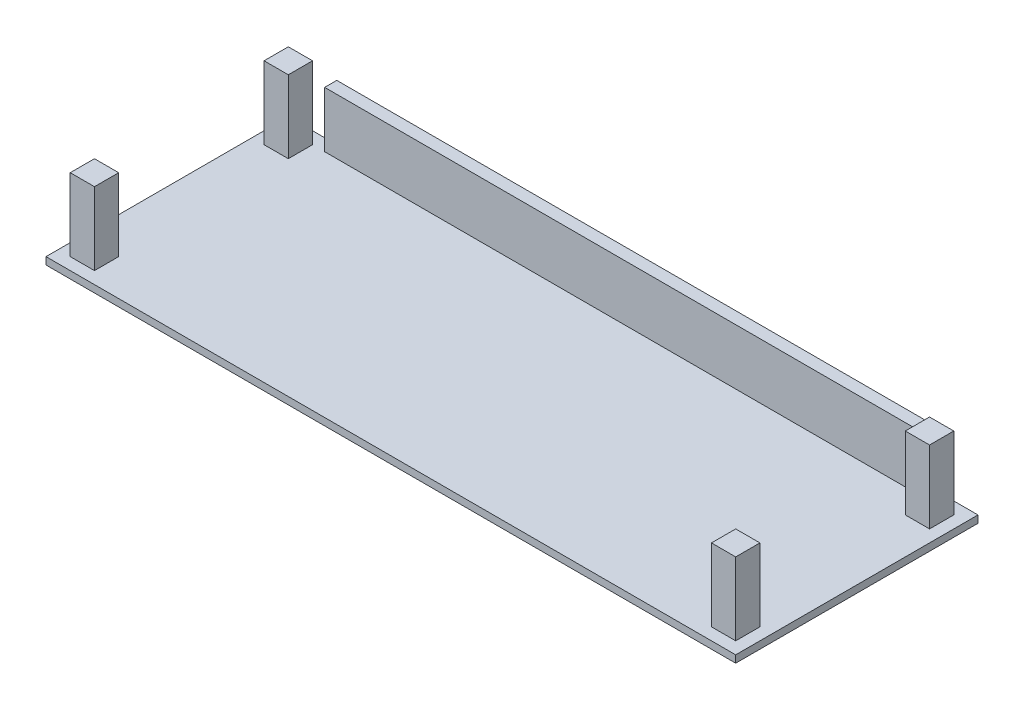
ISO-10303-21;
HEADER;
FILE_DESCRIPTION(('STEP AP214'),'2;1');
FILE_NAME('part.step','',(''),(''),'','','');
FILE_SCHEMA(('AUTOMOTIVE_DESIGN { 1 0 10303 214 1 1 1 1 }'));
ENDSEC;
DATA;
#1=APPLICATION_CONTEXT('core data for automotive mechanical design processes');
#2=APPLICATION_PROTOCOL_DEFINITION('international standard','automotive_design',2000,#1);
#3=PRODUCT_CONTEXT('',#1,'mechanical');
#4=PRODUCT('Part','Part','',(#3));
#5=PRODUCT_RELATED_PRODUCT_CATEGORY('part','',(#4));
#6=PRODUCT_DEFINITION_FORMATION('','',#4);
#7=PRODUCT_DEFINITION_CONTEXT('part definition',#1,'design');
#8=PRODUCT_DEFINITION('design','',#6,#7);
#9=PRODUCT_DEFINITION_SHAPE('','',#8);
#10=(LENGTH_UNIT() NAMED_UNIT(*) SI_UNIT(.MILLI.,.METRE.));
#11=(NAMED_UNIT(*) PLANE_ANGLE_UNIT() SI_UNIT($,.RADIAN.));
#12=(NAMED_UNIT(*) SI_UNIT($,.STERADIAN.) SOLID_ANGLE_UNIT());
#13=UNCERTAINTY_MEASURE_WITH_UNIT(LENGTH_MEASURE(1.E-05),#10,'distance_accuracy_value','');
#14=(GEOMETRIC_REPRESENTATION_CONTEXT(3) GLOBAL_UNCERTAINTY_ASSIGNED_CONTEXT((#13)) GLOBAL_UNIT_ASSIGNED_CONTEXT((#10,
#11,#12)) REPRESENTATION_CONTEXT('',''));
#15=CARTESIAN_POINT('',(0.,0.,0.));
#16=DIRECTION('',(0.,0.,1.));
#17=DIRECTION('',(1.,0.,0.));
#18=AXIS2_PLACEMENT_3D('',#15,#16,#17);
#19=CARTESIAN_POINT('',(0.,0.,0.));
#20=DIRECTION('',(0.,-1.,0.));
#21=DIRECTION('',(0.,0.,-1.));
#22=AXIS2_PLACEMENT_3D('',#19,#20,#21);
#23=PLANE('',#22);
#24=DIRECTION('',(0.,0.,1.));
#25=VECTOR('',#24,1.);
#26=CARTESIAN_POINT('',(127.320508075689,0.,-45.));
#27=LINE('',#26,#25);
#28=CARTESIAN_POINT('',(127.320508075689,0.,-45.));
#29=VERTEX_POINT('',#28);
#30=CARTESIAN_POINT('',(127.320508075689,0.,-35.));
#31=VERTEX_POINT('',#30);
#32=EDGE_CURVE('E221',#29,#31,#27,.T.);
#33=ORIENTED_EDGE('',*,*,#32,.F.);
#34=DIRECTION('',(-1.,0.,0.));
#35=VECTOR('',#34,1.);
#36=CARTESIAN_POINT('',(127.320508075689,0.,-45.));
#37=LINE('',#36,#35);
#38=CARTESIAN_POINT('',(137.320508075689,0.,-45.));
#39=VERTEX_POINT('',#38);
#40=EDGE_CURVE('E234',#39,#29,#37,.T.);
#41=ORIENTED_EDGE('',*,*,#40,.F.);
#42=DIRECTION('',(0.,0.,-1.));
#43=VECTOR('',#42,1.);
#44=CARTESIAN_POINT('',(137.320508075689,0.,-45.));
#45=LINE('',#44,#43);
#46=CARTESIAN_POINT('',(137.320508075689,0.,-35.));
#47=VERTEX_POINT('',#46);
#48=EDGE_CURVE('E243',#47,#39,#45,.T.);
#49=ORIENTED_EDGE('',*,*,#48,.F.);
#50=DIRECTION('',(1.,0.,0.));
#51=VECTOR('',#50,1.);
#52=CARTESIAN_POINT('',(127.320508075689,0.,-35.));
#53=LINE('',#52,#51);
#54=EDGE_CURVE('E224',#31,#47,#53,.T.);
#55=ORIENTED_EDGE('',*,*,#54,.F.);
#56=EDGE_LOOP('',(#33,#41,#49,#55));
#57=FACE_BOUND('',#56,.T.);
#58=DIRECTION('',(0.,0.,1.));
#59=VECTOR('',#58,1.);
#60=CARTESIAN_POINT('',(-137.320508075689,0.,35.));
#61=LINE('',#60,#59);
#62=CARTESIAN_POINT('',(-137.320508075689,0.,35.));
#63=VERTEX_POINT('',#62);
#64=CARTESIAN_POINT('',(-137.320508075689,0.,45.));
#65=VERTEX_POINT('',#64);
#66=EDGE_CURVE('E292',#63,#65,#61,.T.);
#67=ORIENTED_EDGE('',*,*,#66,.F.);
#68=DIRECTION('',(-1.,0.,0.));
#69=VECTOR('',#68,1.);
#70=CARTESIAN_POINT('',(-137.320508075689,0.,35.));
#71=LINE('',#70,#69);
#72=CARTESIAN_POINT('',(-127.320508075689,0.,35.));
#73=VERTEX_POINT('',#72);
#74=EDGE_CURVE('E297',#73,#63,#71,.T.);
#75=ORIENTED_EDGE('',*,*,#74,.F.);
#76=DIRECTION('',(0.,0.,-1.));
#77=VECTOR('',#76,1.);
#78=CARTESIAN_POINT('',(-127.320508075689,0.,35.));
#79=LINE('',#78,#77);
#80=CARTESIAN_POINT('',(-127.320508075689,0.,45.));
#81=VERTEX_POINT('',#80);
#82=EDGE_CURVE('E309',#81,#73,#79,.T.);
#83=ORIENTED_EDGE('',*,*,#82,.F.);
#84=DIRECTION('',(1.,0.,0.));
#85=VECTOR('',#84,1.);
#86=CARTESIAN_POINT('',(-137.320508075689,0.,45.));
#87=LINE('',#86,#85);
#88=EDGE_CURVE('E306',#65,#81,#87,.T.);
#89=ORIENTED_EDGE('',*,*,#88,.F.);
#90=EDGE_LOOP('',(#67,#75,#83,#89));
#91=FACE_BOUND('',#90,.T.);
#92=DIRECTION('',(0.,0.,1.));
#93=VECTOR('',#92,1.);
#94=CARTESIAN_POINT('',(-137.320508075689,0.,-45.));
#95=LINE('',#94,#93);
#96=CARTESIAN_POINT('',(-137.320508075689,0.,-45.));
#97=VERTEX_POINT('',#96);
#98=CARTESIAN_POINT('',(-137.320508075689,0.,-35.));
#99=VERTEX_POINT('',#98);
#100=EDGE_CURVE('E352',#97,#99,#95,.T.);
#101=ORIENTED_EDGE('',*,*,#100,.F.);
#102=DIRECTION('',(-1.,0.,0.));
#103=VECTOR('',#102,1.);
#104=CARTESIAN_POINT('',(-137.320508075689,0.,-45.));
#105=LINE('',#104,#103);
#106=CARTESIAN_POINT('',(-127.320508075689,0.,-45.));
#107=VERTEX_POINT('',#106);
#108=EDGE_CURVE('E363',#107,#97,#105,.T.);
#109=ORIENTED_EDGE('',*,*,#108,.F.);
#110=DIRECTION('',(0.,0.,-1.));
#111=VECTOR('',#110,1.);
#112=CARTESIAN_POINT('',(-127.320508075689,0.,-45.));
#113=LINE('',#112,#111);
#114=CARTESIAN_POINT('',(-127.320508075689,0.,-35.));
#115=VERTEX_POINT('',#114);
#116=EDGE_CURVE('E375',#115,#107,#113,.T.);
#117=ORIENTED_EDGE('',*,*,#116,.F.);
#118=DIRECTION('',(1.,0.,0.));
#119=VECTOR('',#118,1.);
#120=CARTESIAN_POINT('',(-137.320508075689,0.,-35.));
#121=LINE('',#120,#119);
#122=EDGE_CURVE('E372',#99,#115,#121,.T.);
#123=ORIENTED_EDGE('',*,*,#122,.F.);
#124=EDGE_LOOP('',(#101,#109,#117,#123));
#125=FACE_BOUND('',#124,.T.);
#126=DIRECTION('',(0.,0.,1.));
#127=VECTOR('',#126,1.);
#128=CARTESIAN_POINT('',(127.320508075689,0.,35.));
#129=LINE('',#128,#127);
#130=CARTESIAN_POINT('',(127.320508075689,0.,35.));
#131=VERTEX_POINT('',#130);
#132=CARTESIAN_POINT('',(127.320508075689,0.,45.));
#133=VERTEX_POINT('',#132);
#134=EDGE_CURVE('E259',#131,#133,#129,.T.);
#135=ORIENTED_EDGE('',*,*,#134,.F.);
#136=DIRECTION('',(-1.,0.,0.));
#137=VECTOR('',#136,1.);
#138=CARTESIAN_POINT('',(127.320508075689,0.,35.));
#139=LINE('',#138,#137);
#140=CARTESIAN_POINT('',(137.320508075689,0.,35.));
#141=VERTEX_POINT('',#140);
#142=EDGE_CURVE('E264',#141,#131,#139,.T.);
#143=ORIENTED_EDGE('',*,*,#142,.F.);
#144=DIRECTION('',(0.,0.,-1.));
#145=VECTOR('',#144,1.);
#146=CARTESIAN_POINT('',(137.320508075689,0.,35.));
#147=LINE('',#146,#145);
#148=CARTESIAN_POINT('',(137.320508075689,0.,45.));
#149=VERTEX_POINT('',#148);
#150=EDGE_CURVE('E276',#149,#141,#147,.T.);
#151=ORIENTED_EDGE('',*,*,#150,.F.);
#152=DIRECTION('',(1.,0.,0.));
#153=VECTOR('',#152,1.);
#154=CARTESIAN_POINT('',(127.320508075689,0.,45.));
#155=LINE('',#154,#153);
#156=EDGE_CURVE('E273',#133,#149,#155,.T.);
#157=ORIENTED_EDGE('',*,*,#156,.F.);
#158=EDGE_LOOP('',(#135,#143,#151,#157));
#159=FACE_BOUND('',#158,.T.);
#160=DIRECTION('',(0.,0.,1.));
#161=VECTOR('',#160,1.);
#162=CARTESIAN_POINT('',(-122.320508075689,0.,-45.));
#163=LINE('',#162,#161);
#164=CARTESIAN_POINT('',(-122.320508075689,0.,-50.));
#165=VERTEX_POINT('',#164);
#166=CARTESIAN_POINT('',(-122.320508075689,0.,-45.));
#167=VERTEX_POINT('',#166);
#168=EDGE_CURVE('E220',#165,#167,#163,.T.);
#169=ORIENTED_EDGE('',*,*,#168,.F.);
#170=DIRECTION('',(-1.,0.,0.));
#171=VECTOR('',#170,1.);
#172=CARTESIAN_POINT('',(142.320508075689,0.,-50.));
#173=LINE('',#172,#171);
#174=CARTESIAN_POINT('',(-142.320508075689,0.,-50.));
#175=VERTEX_POINT('',#174);
#176=EDGE_CURVE('E342',#165,#175,#173,.T.);
#177=ORIENTED_EDGE('',*,*,#176,.T.);
#178=DIRECTION('',(0.,0.,1.));
#179=VECTOR('',#178,1.);
#180=CARTESIAN_POINT('',(-142.320508075689,0.,-50.));
#181=LINE('',#180,#179);
#182=CARTESIAN_POINT('',(-142.320508075689,0.,50.));
#183=VERTEX_POINT('',#182);
#184=EDGE_CURVE('E345',#175,#183,#181,.T.);
#185=ORIENTED_EDGE('',*,*,#184,.T.);
#186=DIRECTION('',(1.,0.,0.));
#187=VECTOR('',#186,1.);
#188=CARTESIAN_POINT('',(142.320508075689,0.,50.));
#189=LINE('',#188,#187);
#190=CARTESIAN_POINT('',(142.320508075689,0.,50.));
#191=VERTEX_POINT('',#190);
#192=EDGE_CURVE('E330',#183,#191,#189,.T.);
#193=ORIENTED_EDGE('',*,*,#192,.T.);
#194=DIRECTION('',(0.,0.,-1.));
#195=VECTOR('',#194,1.);
#196=CARTESIAN_POINT('',(142.320508075689,0.,-50.));
#197=LINE('',#196,#195);
#198=CARTESIAN_POINT('',(142.320508075689,0.,-50.));
#199=VERTEX_POINT('',#198);
#200=EDGE_CURVE('E325',#191,#199,#197,.T.);
#201=ORIENTED_EDGE('',*,*,#200,.T.);
#202=CARTESIAN_POINT('',(122.317518395017,0.,-50.));
#203=VERTEX_POINT('',#202);
#204=EDGE_CURVE('E343',#199,#203,#173,.T.);
#205=ORIENTED_EDGE('',*,*,#204,.T.);
#206=DIRECTION('',(0.,0.,-1.));
#207=VECTOR('',#206,1.);
#208=CARTESIAN_POINT('',(122.317518395017,0.,-45.));
#209=LINE('',#208,#207);
#210=CARTESIAN_POINT('',(122.317518395017,0.,-45.));
#211=VERTEX_POINT('',#210);
#212=EDGE_CURVE('E59',#211,#203,#209,.T.);
#213=ORIENTED_EDGE('',*,*,#212,.F.);
#214=DIRECTION('',(1.,0.,0.));
#215=VECTOR('',#214,1.);
#216=CARTESIAN_POINT('',(-122.320508075689,0.,-45.));
#217=LINE('',#216,#215);
#218=EDGE_CURVE('E54',#167,#211,#217,.T.);
#219=ORIENTED_EDGE('',*,*,#218,.F.);
#220=EDGE_LOOP('',(#169,#177,#185,#193,#201,#205,#213,#219));
#221=FACE_BOUND('',#220,.T.);
#222=ADVANCED_FACE('F39',(#57,#91,#125,#159,#221),#23,.F.);
#223=CARTESIAN_POINT('',(-137.320508075689,30.,-45.));
#224=DIRECTION('',(1.,0.,0.));
#225=DIRECTION('',(0.,0.,-1.));
#226=AXIS2_PLACEMENT_3D('',#223,#224,#225);
#227=PLANE('',#226);
#228=ORIENTED_EDGE('',*,*,#100,.T.);
#229=DIRECTION('',(0.,-1.,0.));
#230=VECTOR('',#229,1.);
#231=CARTESIAN_POINT('',(-137.320508075689,30.,-35.));
#232=LINE('',#231,#230);
#233=CARTESIAN_POINT('',(-137.320508075689,30.,-35.));
#234=VERTEX_POINT('',#233);
#235=EDGE_CURVE('E11',#234,#99,#232,.T.);
#236=ORIENTED_EDGE('',*,*,#235,.F.);
#237=DIRECTION('',(0.,0.,1.));
#238=VECTOR('',#237,1.);
#239=CARTESIAN_POINT('',(-137.320508075689,30.,-45.));
#240=LINE('',#239,#238);
#241=CARTESIAN_POINT('',(-137.320508075689,30.,-45.));
#242=VERTEX_POINT('',#241);
#243=EDGE_CURVE('E359',#242,#234,#240,.T.);
#244=ORIENTED_EDGE('',*,*,#243,.F.);
#245=DIRECTION('',(0.,-1.,0.));
#246=VECTOR('',#245,1.);
#247=CARTESIAN_POINT('',(-137.320508075689,30.,-45.));
#248=LINE('',#247,#246);
#249=EDGE_CURVE('E369',#242,#97,#248,.T.);
#250=ORIENTED_EDGE('',*,*,#249,.T.);
#251=EDGE_LOOP('',(#228,#236,#244,#250));
#252=FACE_BOUND('',#251,.T.);
#253=ADVANCED_FACE('F41',(#252),#227,.F.);
#254=CARTESIAN_POINT('',(-137.320508075689,30.,-35.));
#255=DIRECTION('',(0.,0.,-1.));
#256=DIRECTION('',(-1.,0.,0.));
#257=AXIS2_PLACEMENT_3D('',#254,#255,#256);
#258=PLANE('',#257);
#259=ORIENTED_EDGE('',*,*,#122,.T.);
#260=DIRECTION('',(0.,-1.,0.));
#261=VECTOR('',#260,1.);
#262=CARTESIAN_POINT('',(-127.320508075689,30.,-35.));
#263=LINE('',#262,#261);
#264=CARTESIAN_POINT('',(-127.320508075689,30.,-35.));
#265=VERTEX_POINT('',#264);
#266=EDGE_CURVE('E47',#265,#115,#263,.T.);
#267=ORIENTED_EDGE('',*,*,#266,.F.);
#268=DIRECTION('',(1.,0.,0.));
#269=VECTOR('',#268,1.);
#270=CARTESIAN_POINT('',(-137.320508075689,30.,-35.));
#271=LINE('',#270,#269);
#272=EDGE_CURVE('E362',#234,#265,#271,.T.);
#273=ORIENTED_EDGE('',*,*,#272,.F.);
#274=ORIENTED_EDGE('',*,*,#235,.T.);
#275=EDGE_LOOP('',(#259,#267,#273,#274));
#276=FACE_BOUND('',#275,.T.);
#277=ADVANCED_FACE('F391',(#276),#258,.F.);
#278=CARTESIAN_POINT('',(-127.320508075689,30.,-45.));
#279=DIRECTION('',(-1.,0.,0.));
#280=DIRECTION('',(0.,0.,1.));
#281=AXIS2_PLACEMENT_3D('',#278,#279,#280);
#282=PLANE('',#281);
#283=ORIENTED_EDGE('',*,*,#116,.T.);
#284=DIRECTION('',(0.,-1.,0.));
#285=VECTOR('',#284,1.);
#286=CARTESIAN_POINT('',(-127.320508075689,30.,-45.));
#287=LINE('',#286,#285);
#288=CARTESIAN_POINT('',(-127.320508075689,30.,-45.));
#289=VERTEX_POINT('',#288);
#290=EDGE_CURVE('E382',#289,#107,#287,.T.);
#291=ORIENTED_EDGE('',*,*,#290,.F.);
#292=DIRECTION('',(0.,0.,-1.));
#293=VECTOR('',#292,1.);
#294=CARTESIAN_POINT('',(-127.320508075689,30.,-45.));
#295=LINE('',#294,#293);
#296=EDGE_CURVE('E365',#265,#289,#295,.T.);
#297=ORIENTED_EDGE('',*,*,#296,.F.);
#298=ORIENTED_EDGE('',*,*,#266,.T.);
#299=EDGE_LOOP('',(#283,#291,#297,#298));
#300=FACE_BOUND('',#299,.T.);
#301=ADVANCED_FACE('F388',(#300),#282,.F.);
#302=CARTESIAN_POINT('',(-137.320508075689,30.,-45.));
#303=DIRECTION('',(0.,0.,1.));
#304=DIRECTION('',(1.,0.,0.));
#305=AXIS2_PLACEMENT_3D('',#302,#303,#304);
#306=PLANE('',#305);
#307=ORIENTED_EDGE('',*,*,#108,.T.);
#308=ORIENTED_EDGE('',*,*,#249,.F.);
#309=DIRECTION('',(-1.,0.,0.));
#310=VECTOR('',#309,1.);
#311=CARTESIAN_POINT('',(-137.320508075689,30.,-45.));
#312=LINE('',#311,#310);
#313=EDGE_CURVE('E367',#289,#242,#312,.T.);
#314=ORIENTED_EDGE('',*,*,#313,.F.);
#315=ORIENTED_EDGE('',*,*,#290,.T.);
#316=EDGE_LOOP('',(#307,#308,#314,#315));
#317=FACE_BOUND('',#316,.T.);
#318=ADVANCED_FACE('F397',(#317),#306,.F.);
#319=CARTESIAN_POINT('',(0.,30.,0.));
#320=DIRECTION('',(0.,1.,0.));
#321=DIRECTION('',(0.,0.,1.));
#322=AXIS2_PLACEMENT_3D('',#319,#320,#321);
#323=PLANE('',#322);
#324=ORIENTED_EDGE('',*,*,#243,.T.);
#325=ORIENTED_EDGE('',*,*,#272,.T.);
#326=ORIENTED_EDGE('',*,*,#296,.T.);
#327=ORIENTED_EDGE('',*,*,#313,.T.);
#328=EDGE_LOOP('',(#324,#325,#326,#327));
#329=FACE_BOUND('',#328,.T.);
#330=ADVANCED_FACE('F402',(#329),#323,.T.);
#331=CARTESIAN_POINT('',(142.320508075689,-3.,-50.));
#332=DIRECTION('',(1.,0.,0.));
#333=DIRECTION('',(0.,0.,-1.));
#334=AXIS2_PLACEMENT_3D('',#331,#332,#333);
#335=PLANE('',#334);
#336=ORIENTED_EDGE('',*,*,#200,.F.);
#337=DIRECTION('',(0.,1.,0.));
#338=VECTOR('',#337,1.);
#339=CARTESIAN_POINT('',(142.320508075689,-3.,50.));
#340=LINE('',#339,#338);
#341=CARTESIAN_POINT('',(142.320508075689,-3.,50.));
#342=VERTEX_POINT('',#341);
#343=EDGE_CURVE('E350',#342,#191,#340,.T.);
#344=ORIENTED_EDGE('',*,*,#343,.F.);
#345=DIRECTION('',(0.,0.,-1.));
#346=VECTOR('',#345,1.);
#347=CARTESIAN_POINT('',(142.320508075689,-3.,-50.));
#348=LINE('',#347,#346);
#349=CARTESIAN_POINT('',(142.320508075689,-3.,-50.));
#350=VERTEX_POINT('',#349);
#351=EDGE_CURVE('E326',#342,#350,#348,.T.);
#352=ORIENTED_EDGE('',*,*,#351,.T.);
#353=DIRECTION('',(0.,1.,0.));
#354=VECTOR('',#353,1.);
#355=CARTESIAN_POINT('',(142.320508075689,-3.,-50.));
#356=LINE('',#355,#354);
#357=EDGE_CURVE('E339',#350,#199,#356,.T.);
#358=ORIENTED_EDGE('',*,*,#357,.T.);
#359=EDGE_LOOP('',(#336,#344,#352,#358));
#360=FACE_BOUND('',#359,.T.);
#361=ADVANCED_FACE('F404',(#360),#335,.T.);
#362=CARTESIAN_POINT('',(142.320508075689,-3.,50.));
#363=DIRECTION('',(0.,0.,1.));
#364=DIRECTION('',(1.,0.,0.));
#365=AXIS2_PLACEMENT_3D('',#362,#363,#364);
#366=PLANE('',#365);
#367=ORIENTED_EDGE('',*,*,#192,.F.);
#368=DIRECTION('',(0.,1.,0.));
#369=VECTOR('',#368,1.);
#370=CARTESIAN_POINT('',(-142.320508075689,-3.,50.));
#371=LINE('',#370,#369);
#372=CARTESIAN_POINT('',(-142.320508075689,-3.,50.));
#373=VERTEX_POINT('',#372);
#374=EDGE_CURVE('E353',#373,#183,#371,.T.);
#375=ORIENTED_EDGE('',*,*,#374,.F.);
#376=DIRECTION('',(1.,0.,0.));
#377=VECTOR('',#376,1.);
#378=CARTESIAN_POINT('',(142.320508075689,-3.,50.));
#379=LINE('',#378,#377);
#380=EDGE_CURVE('E336',#373,#342,#379,.T.);
#381=ORIENTED_EDGE('',*,*,#380,.T.);
#382=ORIENTED_EDGE('',*,*,#343,.T.);
#383=EDGE_LOOP('',(#367,#375,#381,#382));
#384=FACE_BOUND('',#383,.T.);
#385=ADVANCED_FACE('F410',(#384),#366,.T.);
#386=CARTESIAN_POINT('',(-142.320508075689,-3.,-50.));
#387=DIRECTION('',(-1.,0.,0.));
#388=DIRECTION('',(0.,0.,1.));
#389=AXIS2_PLACEMENT_3D('',#386,#387,#388);
#390=PLANE('',#389);
#391=ORIENTED_EDGE('',*,*,#184,.F.);
#392=DIRECTION('',(0.,1.,0.));
#393=VECTOR('',#392,1.);
#394=CARTESIAN_POINT('',(-142.320508075689,-3.,-50.));
#395=LINE('',#394,#393);
#396=CARTESIAN_POINT('',(-142.320508075689,-3.,-50.));
#397=VERTEX_POINT('',#396);
#398=EDGE_CURVE('E355',#397,#175,#395,.T.);
#399=ORIENTED_EDGE('',*,*,#398,.F.);
#400=DIRECTION('',(0.,0.,1.));
#401=VECTOR('',#400,1.);
#402=CARTESIAN_POINT('',(-142.320508075689,-3.,-50.));
#403=LINE('',#402,#401);
#404=EDGE_CURVE('E333',#397,#373,#403,.T.);
#405=ORIENTED_EDGE('',*,*,#404,.T.);
#406=ORIENTED_EDGE('',*,*,#374,.T.);
#407=EDGE_LOOP('',(#391,#399,#405,#406));
#408=FACE_BOUND('',#407,.T.);
#409=ADVANCED_FACE('F429',(#408),#390,.T.);
#410=CARTESIAN_POINT('',(142.320508075689,-3.,-50.));
#411=DIRECTION('',(0.,0.,-1.));
#412=DIRECTION('',(-1.,0.,0.));
#413=AXIS2_PLACEMENT_3D('',#410,#411,#412);
#414=PLANE('',#413);
#415=ORIENTED_EDGE('',*,*,#204,.F.);
#416=ORIENTED_EDGE('',*,*,#357,.F.);
#417=DIRECTION('',(-1.,0.,0.));
#418=VECTOR('',#417,1.);
#419=CARTESIAN_POINT('',(142.320508075689,-3.,-50.));
#420=LINE('',#419,#418);
#421=EDGE_CURVE('E329',#350,#397,#420,.T.);
#422=ORIENTED_EDGE('',*,*,#421,.T.);
#423=ORIENTED_EDGE('',*,*,#398,.T.);
#424=ORIENTED_EDGE('',*,*,#176,.F.);
#425=DIRECTION('',(0.,-1.,0.));
#426=VECTOR('',#425,1.);
#427=CARTESIAN_POINT('',(-122.320508075689,23.,-50.));
#428=LINE('',#427,#426);
#429=CARTESIAN_POINT('',(-122.320508075689,23.,-50.));
#430=VERTEX_POINT('',#429);
#431=EDGE_CURVE('E454',#430,#165,#428,.T.);
#432=ORIENTED_EDGE('',*,*,#431,.F.);
#433=DIRECTION('',(-1.,0.,0.));
#434=VECTOR('',#433,1.);
#435=CARTESIAN_POINT('',(-122.320508075689,23.,-50.));
#436=LINE('',#435,#434);
#437=CARTESIAN_POINT('',(122.317518395017,23.,-50.));
#438=VERTEX_POINT('',#437);
#439=EDGE_CURVE('E214',#438,#430,#436,.T.);
#440=ORIENTED_EDGE('',*,*,#439,.F.);
#441=DIRECTION('',(0.,-1.,0.));
#442=VECTOR('',#441,1.);
#443=CARTESIAN_POINT('',(122.317518395017,23.,-50.));
#444=LINE('',#443,#442);
#445=EDGE_CURVE('E226',#438,#203,#444,.T.);
#446=ORIENTED_EDGE('',*,*,#445,.T.);
#447=EDGE_LOOP('',(#415,#416,#422,#423,#424,#432,#440,#446));
#448=FACE_BOUND('',#447,.T.);
#449=ADVANCED_FACE('F433',(#448),#414,.T.);
#450=CARTESIAN_POINT('',(0.,-3.,0.));
#451=DIRECTION('',(0.,-1.,0.));
#452=DIRECTION('',(0.,0.,-1.));
#453=AXIS2_PLACEMENT_3D('',#450,#451,#452);
#454=PLANE('',#453);
#455=ORIENTED_EDGE('',*,*,#351,.F.);
#456=ORIENTED_EDGE('',*,*,#380,.F.);
#457=ORIENTED_EDGE('',*,*,#404,.F.);
#458=ORIENTED_EDGE('',*,*,#421,.F.);
#459=EDGE_LOOP('',(#455,#456,#457,#458));
#460=FACE_BOUND('',#459,.T.);
#461=ADVANCED_FACE('F425',(#460),#454,.T.);
#462=CARTESIAN_POINT('',(-137.320508075689,30.,35.));
#463=DIRECTION('',(1.,0.,0.));
#464=DIRECTION('',(0.,0.,-1.));
#465=AXIS2_PLACEMENT_3D('',#462,#463,#464);
#466=PLANE('',#465);
#467=ORIENTED_EDGE('',*,*,#66,.T.);
#468=DIRECTION('',(0.,-1.,0.));
#469=VECTOR('',#468,1.);
#470=CARTESIAN_POINT('',(-137.320508075689,30.,45.));
#471=LINE('',#470,#469);
#472=CARTESIAN_POINT('',(-137.320508075689,30.,45.));
#473=VERTEX_POINT('',#472);
#474=EDGE_CURVE('E322',#473,#65,#471,.T.);
#475=ORIENTED_EDGE('',*,*,#474,.F.);
#476=DIRECTION('',(0.,0.,1.));
#477=VECTOR('',#476,1.);
#478=CARTESIAN_POINT('',(-137.320508075689,30.,35.));
#479=LINE('',#478,#477);
#480=CARTESIAN_POINT('',(-137.320508075689,30.,35.));
#481=VERTEX_POINT('',#480);
#482=EDGE_CURVE('E293',#481,#473,#479,.T.);
#483=ORIENTED_EDGE('',*,*,#482,.F.);
#484=DIRECTION('',(0.,-1.,0.));
#485=VECTOR('',#484,1.);
#486=CARTESIAN_POINT('',(-137.320508075689,30.,35.));
#487=LINE('',#486,#485);
#488=EDGE_CURVE('E303',#481,#63,#487,.T.);
#489=ORIENTED_EDGE('',*,*,#488,.T.);
#490=EDGE_LOOP('',(#467,#475,#483,#489));
#491=FACE_BOUND('',#490,.T.);
#492=ADVANCED_FACE('F441',(#491),#466,.F.);
#493=CARTESIAN_POINT('',(-137.320508075689,30.,45.));
#494=DIRECTION('',(0.,0.,-1.));
#495=DIRECTION('',(-1.,0.,0.));
#496=AXIS2_PLACEMENT_3D('',#493,#494,#495);
#497=PLANE('',#496);
#498=ORIENTED_EDGE('',*,*,#88,.T.);
#499=DIRECTION('',(0.,-1.,0.));
#500=VECTOR('',#499,1.);
#501=CARTESIAN_POINT('',(-127.320508075689,30.,45.));
#502=LINE('',#501,#500);
#503=CARTESIAN_POINT('',(-127.320508075689,30.,45.));
#504=VERTEX_POINT('',#503);
#505=EDGE_CURVE('E319',#504,#81,#502,.T.);
#506=ORIENTED_EDGE('',*,*,#505,.F.);
#507=DIRECTION('',(1.,0.,0.));
#508=VECTOR('',#507,1.);
#509=CARTESIAN_POINT('',(-137.320508075689,30.,45.));
#510=LINE('',#509,#508);
#511=EDGE_CURVE('E296',#473,#504,#510,.T.);
#512=ORIENTED_EDGE('',*,*,#511,.F.);
#513=ORIENTED_EDGE('',*,*,#474,.T.);
#514=EDGE_LOOP('',(#498,#506,#512,#513));
#515=FACE_BOUND('',#514,.T.);
#516=ADVANCED_FACE('F523',(#515),#497,.F.);
#517=CARTESIAN_POINT('',(-127.320508075689,30.,35.));
#518=DIRECTION('',(-1.,0.,0.));
#519=DIRECTION('',(0.,0.,1.));
#520=AXIS2_PLACEMENT_3D('',#517,#518,#519);
#521=PLANE('',#520);
#522=ORIENTED_EDGE('',*,*,#82,.T.);
#523=DIRECTION('',(0.,-1.,0.));
#524=VECTOR('',#523,1.);
#525=CARTESIAN_POINT('',(-127.320508075689,30.,35.));
#526=LINE('',#525,#524);
#527=CARTESIAN_POINT('',(-127.320508075689,30.,35.));
#528=VERTEX_POINT('',#527);
#529=EDGE_CURVE('E316',#528,#73,#526,.T.);
#530=ORIENTED_EDGE('',*,*,#529,.F.);
#531=DIRECTION('',(0.,0.,-1.));
#532=VECTOR('',#531,1.);
#533=CARTESIAN_POINT('',(-127.320508075689,30.,35.));
#534=LINE('',#533,#532);
#535=EDGE_CURVE('E299',#504,#528,#534,.T.);
#536=ORIENTED_EDGE('',*,*,#535,.F.);
#537=ORIENTED_EDGE('',*,*,#505,.T.);
#538=EDGE_LOOP('',(#522,#530,#536,#537));
#539=FACE_BOUND('',#538,.T.);
#540=ADVANCED_FACE('F519',(#539),#521,.F.);
#541=CARTESIAN_POINT('',(-137.320508075689,30.,35.));
#542=DIRECTION('',(0.,0.,1.));
#543=DIRECTION('',(1.,0.,0.));
#544=AXIS2_PLACEMENT_3D('',#541,#542,#543);
#545=PLANE('',#544);
#546=ORIENTED_EDGE('',*,*,#74,.T.);
#547=ORIENTED_EDGE('',*,*,#488,.F.);
#548=DIRECTION('',(-1.,0.,0.));
#549=VECTOR('',#548,1.);
#550=CARTESIAN_POINT('',(-137.320508075689,30.,35.));
#551=LINE('',#550,#549);
#552=EDGE_CURVE('E301',#528,#481,#551,.T.);
#553=ORIENTED_EDGE('',*,*,#552,.F.);
#554=ORIENTED_EDGE('',*,*,#529,.T.);
#555=EDGE_LOOP('',(#546,#547,#553,#554));
#556=FACE_BOUND('',#555,.T.);
#557=ADVANCED_FACE('F515',(#556),#545,.F.);
#558=CARTESIAN_POINT('',(0.,30.,0.));
#559=DIRECTION('',(0.,1.,0.));
#560=DIRECTION('',(0.,0.,1.));
#561=AXIS2_PLACEMENT_3D('',#558,#559,#560);
#562=PLANE('',#561);
#563=ORIENTED_EDGE('',*,*,#482,.T.);
#564=ORIENTED_EDGE('',*,*,#511,.T.);
#565=ORIENTED_EDGE('',*,*,#535,.T.);
#566=ORIENTED_EDGE('',*,*,#552,.T.);
#567=EDGE_LOOP('',(#563,#564,#565,#566));
#568=FACE_BOUND('',#567,.T.);
#569=ADVANCED_FACE('F511',(#568),#562,.T.);
#570=CARTESIAN_POINT('',(127.320508075689,30.,35.));
#571=DIRECTION('',(1.,0.,0.));
#572=DIRECTION('',(0.,0.,-1.));
#573=AXIS2_PLACEMENT_3D('',#570,#571,#572);
#574=PLANE('',#573);
#575=ORIENTED_EDGE('',*,*,#134,.T.);
#576=DIRECTION('',(0.,-1.,0.));
#577=VECTOR('',#576,1.);
#578=CARTESIAN_POINT('',(127.320508075689,30.,45.));
#579=LINE('',#578,#577);
#580=CARTESIAN_POINT('',(127.320508075689,30.,45.));
#581=VERTEX_POINT('',#580);
#582=EDGE_CURVE('E289',#581,#133,#579,.T.);
#583=ORIENTED_EDGE('',*,*,#582,.F.);
#584=DIRECTION('',(0.,0.,1.));
#585=VECTOR('',#584,1.);
#586=CARTESIAN_POINT('',(127.320508075689,30.,35.));
#587=LINE('',#586,#585);
#588=CARTESIAN_POINT('',(127.320508075689,30.,35.));
#589=VERTEX_POINT('',#588);
#590=EDGE_CURVE('E260',#589,#581,#587,.T.);
#591=ORIENTED_EDGE('',*,*,#590,.F.);
#592=DIRECTION('',(0.,-1.,0.));
#593=VECTOR('',#592,1.);
#594=CARTESIAN_POINT('',(127.320508075689,30.,35.));
#595=LINE('',#594,#593);
#596=EDGE_CURVE('E270',#589,#131,#595,.T.);
#597=ORIENTED_EDGE('',*,*,#596,.T.);
#598=EDGE_LOOP('',(#575,#583,#591,#597));
#599=FACE_BOUND('',#598,.T.);
#600=ADVANCED_FACE('F507',(#599),#574,.F.);
#601=CARTESIAN_POINT('',(127.320508075689,30.,45.));
#602=DIRECTION('',(0.,0.,-1.));
#603=DIRECTION('',(-1.,0.,0.));
#604=AXIS2_PLACEMENT_3D('',#601,#602,#603);
#605=PLANE('',#604);
#606=ORIENTED_EDGE('',*,*,#156,.T.);
#607=DIRECTION('',(0.,-1.,0.));
#608=VECTOR('',#607,1.);
#609=CARTESIAN_POINT('',(137.320508075689,30.,45.));
#610=LINE('',#609,#608);
#611=CARTESIAN_POINT('',(137.320508075689,30.,45.));
#612=VERTEX_POINT('',#611);
#613=EDGE_CURVE('E286',#612,#149,#610,.T.);
#614=ORIENTED_EDGE('',*,*,#613,.F.);
#615=DIRECTION('',(1.,0.,0.));
#616=VECTOR('',#615,1.);
#617=CARTESIAN_POINT('',(127.320508075689,30.,45.));
#618=LINE('',#617,#616);
#619=EDGE_CURVE('E263',#581,#612,#618,.T.);
#620=ORIENTED_EDGE('',*,*,#619,.F.);
#621=ORIENTED_EDGE('',*,*,#582,.T.);
#622=EDGE_LOOP('',(#606,#614,#620,#621));
#623=FACE_BOUND('',#622,.T.);
#624=ADVANCED_FACE('F503',(#623),#605,.F.);
#625=CARTESIAN_POINT('',(137.320508075689,30.,35.));
#626=DIRECTION('',(-1.,0.,0.));
#627=DIRECTION('',(0.,0.,1.));
#628=AXIS2_PLACEMENT_3D('',#625,#626,#627);
#629=PLANE('',#628);
#630=ORIENTED_EDGE('',*,*,#150,.T.);
#631=DIRECTION('',(0.,-1.,0.));
#632=VECTOR('',#631,1.);
#633=CARTESIAN_POINT('',(137.320508075689,30.,35.));
#634=LINE('',#633,#632);
#635=CARTESIAN_POINT('',(137.320508075689,30.,35.));
#636=VERTEX_POINT('',#635);
#637=EDGE_CURVE('E283',#636,#141,#634,.T.);
#638=ORIENTED_EDGE('',*,*,#637,.F.);
#639=DIRECTION('',(0.,0.,-1.));
#640=VECTOR('',#639,1.);
#641=CARTESIAN_POINT('',(137.320508075689,30.,35.));
#642=LINE('',#641,#640);
#643=EDGE_CURVE('E266',#612,#636,#642,.T.);
#644=ORIENTED_EDGE('',*,*,#643,.F.);
#645=ORIENTED_EDGE('',*,*,#613,.T.);
#646=EDGE_LOOP('',(#630,#638,#644,#645));
#647=FACE_BOUND('',#646,.T.);
#648=ADVANCED_FACE('F499',(#647),#629,.F.);
#649=CARTESIAN_POINT('',(127.320508075689,30.,35.));
#650=DIRECTION('',(0.,0.,1.));
#651=DIRECTION('',(1.,0.,0.));
#652=AXIS2_PLACEMENT_3D('',#649,#650,#651);
#653=PLANE('',#652);
#654=ORIENTED_EDGE('',*,*,#142,.T.);
#655=ORIENTED_EDGE('',*,*,#596,.F.);
#656=DIRECTION('',(-1.,0.,0.));
#657=VECTOR('',#656,1.);
#658=CARTESIAN_POINT('',(127.320508075689,30.,35.));
#659=LINE('',#658,#657);
#660=EDGE_CURVE('E268',#636,#589,#659,.T.);
#661=ORIENTED_EDGE('',*,*,#660,.F.);
#662=ORIENTED_EDGE('',*,*,#637,.T.);
#663=EDGE_LOOP('',(#654,#655,#661,#662));
#664=FACE_BOUND('',#663,.T.);
#665=ADVANCED_FACE('F495',(#664),#653,.F.);
#666=CARTESIAN_POINT('',(0.,30.,0.));
#667=DIRECTION('',(0.,1.,0.));
#668=DIRECTION('',(0.,0.,1.));
#669=AXIS2_PLACEMENT_3D('',#666,#667,#668);
#670=PLANE('',#669);
#671=ORIENTED_EDGE('',*,*,#590,.T.);
#672=ORIENTED_EDGE('',*,*,#619,.T.);
#673=ORIENTED_EDGE('',*,*,#643,.T.);
#674=ORIENTED_EDGE('',*,*,#660,.T.);
#675=EDGE_LOOP('',(#671,#672,#673,#674));
#676=FACE_BOUND('',#675,.T.);
#677=ADVANCED_FACE('F491',(#676),#670,.T.);
#678=CARTESIAN_POINT('',(127.320508075689,30.,-45.));
#679=DIRECTION('',(1.,0.,0.));
#680=DIRECTION('',(0.,0.,-1.));
#681=AXIS2_PLACEMENT_3D('',#678,#679,#680);
#682=PLANE('',#681);
#683=ORIENTED_EDGE('',*,*,#32,.T.);
#684=DIRECTION('',(0.,-1.,0.));
#685=VECTOR('',#684,1.);
#686=CARTESIAN_POINT('',(127.320508075689,30.,-35.));
#687=LINE('',#686,#685);
#688=CARTESIAN_POINT('',(127.320508075689,30.,-35.));
#689=VERTEX_POINT('',#688);
#690=EDGE_CURVE('E256',#689,#31,#687,.T.);
#691=ORIENTED_EDGE('',*,*,#690,.F.);
#692=DIRECTION('',(0.,0.,1.));
#693=VECTOR('',#692,1.);
#694=CARTESIAN_POINT('',(127.320508075689,30.,-45.));
#695=LINE('',#694,#693);
#696=CARTESIAN_POINT('',(127.320508075689,30.,-45.));
#697=VERTEX_POINT('',#696);
#698=EDGE_CURVE('E230',#697,#689,#695,.T.);
#699=ORIENTED_EDGE('',*,*,#698,.F.);
#700=DIRECTION('',(0.,-1.,0.));
#701=VECTOR('',#700,1.);
#702=CARTESIAN_POINT('',(127.320508075689,30.,-45.));
#703=LINE('',#702,#701);
#704=EDGE_CURVE('E239',#697,#29,#703,.T.);
#705=ORIENTED_EDGE('',*,*,#704,.T.);
#706=EDGE_LOOP('',(#683,#691,#699,#705));
#707=FACE_BOUND('',#706,.T.);
#708=ADVANCED_FACE('F487',(#707),#682,.F.);
#709=CARTESIAN_POINT('',(127.320508075689,30.,-35.));
#710=DIRECTION('',(0.,0.,-1.));
#711=DIRECTION('',(-1.,0.,0.));
#712=AXIS2_PLACEMENT_3D('',#709,#710,#711);
#713=PLANE('',#712);
#714=ORIENTED_EDGE('',*,*,#54,.T.);
#715=DIRECTION('',(0.,-1.,0.));
#716=VECTOR('',#715,1.);
#717=CARTESIAN_POINT('',(137.320508075689,30.,-35.));
#718=LINE('',#717,#716);
#719=CARTESIAN_POINT('',(137.320508075689,30.,-35.));
#720=VERTEX_POINT('',#719);
#721=EDGE_CURVE('E253',#720,#47,#718,.T.);
#722=ORIENTED_EDGE('',*,*,#721,.F.);
#723=DIRECTION('',(1.,0.,0.));
#724=VECTOR('',#723,1.);
#725=CARTESIAN_POINT('',(127.320508075689,30.,-35.));
#726=LINE('',#725,#724);
#727=EDGE_CURVE('E233',#689,#720,#726,.T.);
#728=ORIENTED_EDGE('',*,*,#727,.F.);
#729=ORIENTED_EDGE('',*,*,#690,.T.);
#730=EDGE_LOOP('',(#714,#722,#728,#729));
#731=FACE_BOUND('',#730,.T.);
#732=ADVANCED_FACE('F483',(#731),#713,.F.);
#733=CARTESIAN_POINT('',(137.320508075689,30.,-45.));
#734=DIRECTION('',(-1.,0.,0.));
#735=DIRECTION('',(0.,0.,1.));
#736=AXIS2_PLACEMENT_3D('',#733,#734,#735);
#737=PLANE('',#736);
#738=ORIENTED_EDGE('',*,*,#48,.T.);
#739=DIRECTION('',(0.,-1.,0.));
#740=VECTOR('',#739,1.);
#741=CARTESIAN_POINT('',(137.320508075689,30.,-45.));
#742=LINE('',#741,#740);
#743=CARTESIAN_POINT('',(137.320508075689,30.,-45.));
#744=VERTEX_POINT('',#743);
#745=EDGE_CURVE('E250',#744,#39,#742,.T.);
#746=ORIENTED_EDGE('',*,*,#745,.F.);
#747=DIRECTION('',(0.,0.,-1.));
#748=VECTOR('',#747,1.);
#749=CARTESIAN_POINT('',(137.320508075689,30.,-45.));
#750=LINE('',#749,#748);
#751=EDGE_CURVE('E236',#720,#744,#750,.T.);
#752=ORIENTED_EDGE('',*,*,#751,.F.);
#753=ORIENTED_EDGE('',*,*,#721,.T.);
#754=EDGE_LOOP('',(#738,#746,#752,#753));
#755=FACE_BOUND('',#754,.T.);
#756=ADVANCED_FACE('F479',(#755),#737,.F.);
#757=CARTESIAN_POINT('',(127.320508075689,30.,-45.));
#758=DIRECTION('',(0.,0.,1.));
#759=DIRECTION('',(1.,0.,0.));
#760=AXIS2_PLACEMENT_3D('',#757,#758,#759);
#761=PLANE('',#760);
#762=ORIENTED_EDGE('',*,*,#40,.T.);
#763=ORIENTED_EDGE('',*,*,#704,.F.);
#764=DIRECTION('',(-1.,0.,0.));
#765=VECTOR('',#764,1.);
#766=CARTESIAN_POINT('',(127.320508075689,30.,-45.));
#767=LINE('',#766,#765);
#768=EDGE_CURVE('E238',#744,#697,#767,.T.);
#769=ORIENTED_EDGE('',*,*,#768,.F.);
#770=ORIENTED_EDGE('',*,*,#745,.T.);
#771=EDGE_LOOP('',(#762,#763,#769,#770));
#772=FACE_BOUND('',#771,.T.);
#773=ADVANCED_FACE('F475',(#772),#761,.F.);
#774=CARTESIAN_POINT('',(0.,30.,0.));
#775=DIRECTION('',(0.,1.,0.));
#776=DIRECTION('',(0.,0.,1.));
#777=AXIS2_PLACEMENT_3D('',#774,#775,#776);
#778=PLANE('',#777);
#779=ORIENTED_EDGE('',*,*,#698,.T.);
#780=ORIENTED_EDGE('',*,*,#727,.T.);
#781=ORIENTED_EDGE('',*,*,#751,.T.);
#782=ORIENTED_EDGE('',*,*,#768,.T.);
#783=EDGE_LOOP('',(#779,#780,#781,#782));
#784=FACE_BOUND('',#783,.T.);
#785=ADVANCED_FACE('F472',(#784),#778,.T.);
#786=CARTESIAN_POINT('',(-122.320508075689,23.,-45.));
#787=DIRECTION('',(1.,0.,0.));
#788=DIRECTION('',(0.,0.,-1.));
#789=AXIS2_PLACEMENT_3D('',#786,#787,#788);
#790=PLANE('',#789);
#791=ORIENTED_EDGE('',*,*,#168,.T.);
#792=DIRECTION('',(0.,-1.,0.));
#793=VECTOR('',#792,1.);
#794=CARTESIAN_POINT('',(-122.320508075689,23.,-45.));
#795=LINE('',#794,#793);
#796=CARTESIAN_POINT('',(-122.320508075689,23.,-45.));
#797=VERTEX_POINT('',#796);
#798=EDGE_CURVE('E202',#797,#167,#795,.T.);
#799=ORIENTED_EDGE('',*,*,#798,.F.);
#800=DIRECTION('',(0.,0.,1.));
#801=VECTOR('',#800,1.);
#802=CARTESIAN_POINT('',(-122.320508075689,23.,-45.));
#803=LINE('',#802,#801);
#804=EDGE_CURVE('E209',#430,#797,#803,.T.);
#805=ORIENTED_EDGE('',*,*,#804,.F.);
#806=ORIENTED_EDGE('',*,*,#431,.T.);
#807=EDGE_LOOP('',(#791,#799,#805,#806));
#808=FACE_BOUND('',#807,.T.);
#809=ADVANCED_FACE('F219',(#808),#790,.F.);
#810=CARTESIAN_POINT('',(-122.320508075689,23.,-45.));
#811=DIRECTION('',(0.,0.,-1.));
#812=DIRECTION('',(-1.,0.,0.));
#813=AXIS2_PLACEMENT_3D('',#810,#811,#812);
#814=PLANE('',#813);
#815=ORIENTED_EDGE('',*,*,#218,.T.);
#816=DIRECTION('',(0.,-1.,0.));
#817=VECTOR('',#816,1.);
#818=CARTESIAN_POINT('',(122.317518395017,23.,-45.));
#819=LINE('',#818,#817);
#820=CARTESIAN_POINT('',(122.317518395017,23.,-45.));
#821=VERTEX_POINT('',#820);
#822=EDGE_CURVE('E205',#821,#211,#819,.T.);
#823=ORIENTED_EDGE('',*,*,#822,.F.);
#824=DIRECTION('',(1.,0.,0.));
#825=VECTOR('',#824,1.);
#826=CARTESIAN_POINT('',(-122.320508075689,23.,-45.));
#827=LINE('',#826,#825);
#828=EDGE_CURVE('E198',#797,#821,#827,.T.);
#829=ORIENTED_EDGE('',*,*,#828,.F.);
#830=ORIENTED_EDGE('',*,*,#798,.T.);
#831=EDGE_LOOP('',(#815,#823,#829,#830));
#832=FACE_BOUND('',#831,.T.);
#833=ADVANCED_FACE('F200',(#832),#814,.F.);
#834=CARTESIAN_POINT('',(122.317518395017,23.,-45.));
#835=DIRECTION('',(-1.,0.,0.));
#836=DIRECTION('',(0.,0.,1.));
#837=AXIS2_PLACEMENT_3D('',#834,#835,#836);
#838=PLANE('',#837);
#839=ORIENTED_EDGE('',*,*,#212,.T.);
#840=ORIENTED_EDGE('',*,*,#445,.F.);
#841=DIRECTION('',(0.,0.,-1.));
#842=VECTOR('',#841,1.);
#843=CARTESIAN_POINT('',(122.317518395017,23.,-45.));
#844=LINE('',#843,#842);
#845=EDGE_CURVE('E208',#821,#438,#844,.T.);
#846=ORIENTED_EDGE('',*,*,#845,.F.);
#847=ORIENTED_EDGE('',*,*,#822,.T.);
#848=EDGE_LOOP('',(#839,#840,#846,#847));
#849=FACE_BOUND('',#848,.T.);
#850=ADVANCED_FACE('F461',(#849),#838,.F.);
#851=CARTESIAN_POINT('',(0.,23.,0.));
#852=DIRECTION('',(0.,-1.,0.));
#853=DIRECTION('',(0.,0.,-1.));
#854=AXIS2_PLACEMENT_3D('',#851,#852,#853);
#855=PLANE('',#854);
#856=ORIENTED_EDGE('',*,*,#804,.T.);
#857=ORIENTED_EDGE('',*,*,#828,.T.);
#858=ORIENTED_EDGE('',*,*,#845,.T.);
#859=ORIENTED_EDGE('',*,*,#439,.T.);
#860=EDGE_LOOP('',(#856,#857,#858,#859));
#861=FACE_BOUND('',#860,.T.);
#862=ADVANCED_FACE('F212',(#861),#855,.F.);
#863=CLOSED_SHELL('',(#222,#253,#277,#301,#318,#330,#361,#385,#409,#449,#461,#492,#516,#540,
#557,#569,#600,#624,#648,#665,#677,#708,#732,#756,#773,#785,#809,#833,#850,#862));
#864=MANIFOLD_SOLID_BREP('B2',#863);
#865=ADVANCED_BREP_SHAPE_REPRESENTATION('',(#18,#864),#14);
#866=SHAPE_DEFINITION_REPRESENTATION(#9,#865);
ENDSEC;
END-ISO-10303-21;
